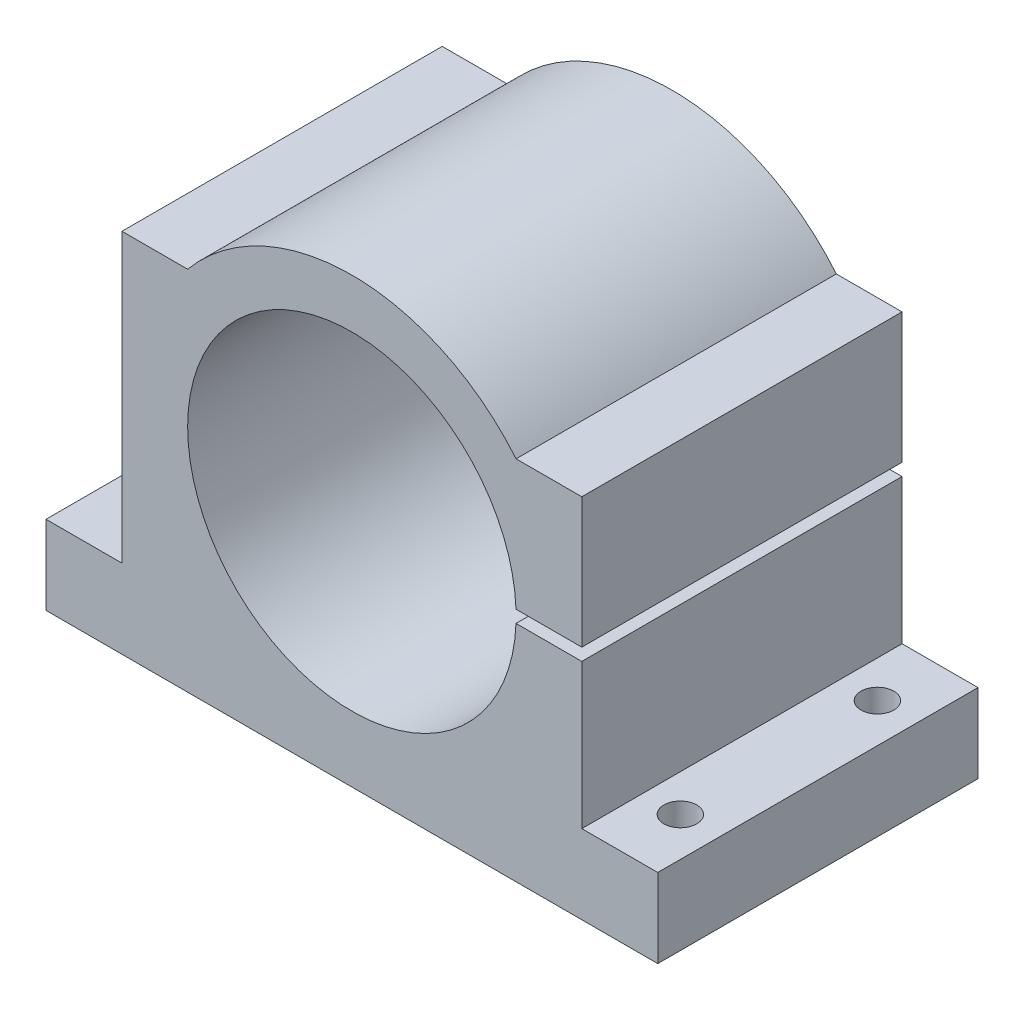
ISO-10303-21;
HEADER;
FILE_DESCRIPTION(('STEP AP214'),'2;1');
FILE_NAME('part.step','',(''),(''),'','','');
FILE_SCHEMA(('AUTOMOTIVE_DESIGN { 1 0 10303 214 1 1 1 1 }'));
ENDSEC;
DATA;
#1=APPLICATION_CONTEXT('core data for automotive mechanical design processes');
#2=APPLICATION_PROTOCOL_DEFINITION('international standard','automotive_design',2000,#1);
#3=PRODUCT_CONTEXT('',#1,'mechanical');
#4=PRODUCT('Part','Part','',(#3));
#5=PRODUCT_RELATED_PRODUCT_CATEGORY('part','',(#4));
#6=PRODUCT_DEFINITION_FORMATION('','',#4);
#7=PRODUCT_DEFINITION_CONTEXT('part definition',#1,'design');
#8=PRODUCT_DEFINITION('design','',#6,#7);
#9=PRODUCT_DEFINITION_SHAPE('','',#8);
#10=(LENGTH_UNIT() NAMED_UNIT(*) SI_UNIT(.MILLI.,.METRE.));
#11=(NAMED_UNIT(*) PLANE_ANGLE_UNIT() SI_UNIT($,.RADIAN.));
#12=(NAMED_UNIT(*) SI_UNIT($,.STERADIAN.) SOLID_ANGLE_UNIT());
#13=UNCERTAINTY_MEASURE_WITH_UNIT(LENGTH_MEASURE(1.E-05),#10,'distance_accuracy_value','');
#14=(GEOMETRIC_REPRESENTATION_CONTEXT(3) GLOBAL_UNCERTAINTY_ASSIGNED_CONTEXT((#13)) GLOBAL_UNIT_ASSIGNED_CONTEXT((#10,
#11,#12)) REPRESENTATION_CONTEXT('',''));
#15=CARTESIAN_POINT('',(0.,0.,0.));
#16=DIRECTION('',(0.,0.,1.));
#17=DIRECTION('',(1.,0.,0.));
#18=AXIS2_PLACEMENT_3D('',#15,#16,#17);
#19=CARTESIAN_POINT('',(0.,0.,78.));
#20=DIRECTION('',(1.,0.,0.));
#21=DIRECTION('',(0.,0.,-1.));
#22=AXIS2_PLACEMENT_3D('',#19,#20,#21);
#23=PLANE('',#22);
#24=DIRECTION('',(0.,-1.,0.));
#25=VECTOR('',#24,1.);
#26=CARTESIAN_POINT('',(0.,0.,0.));
#27=LINE('',#26,#25);
#28=CARTESIAN_POINT('',(0.,19.2264954516723,0.));
#29=VERTEX_POINT('',#28);
#30=CARTESIAN_POINT('',(0.,0.,0.));
#31=VERTEX_POINT('',#30);
#32=EDGE_CURVE('E166',#29,#31,#27,.T.);
#33=ORIENTED_EDGE('',*,*,#32,.T.);
#34=DIRECTION('',(0.,0.,-1.));
#35=VECTOR('',#34,1.);
#36=CARTESIAN_POINT('',(0.,0.,78.));
#37=LINE('',#36,#35);
#38=CARTESIAN_POINT('',(0.,0.,78.));
#39=VERTEX_POINT('',#38);
#40=EDGE_CURVE('E11',#39,#31,#37,.T.);
#41=ORIENTED_EDGE('',*,*,#40,.F.);
#42=DIRECTION('',(0.,-1.,0.));
#43=VECTOR('',#42,1.);
#44=CARTESIAN_POINT('',(0.,0.,78.));
#45=LINE('',#44,#43);
#46=CARTESIAN_POINT('',(0.,19.2264954516723,78.));
#47=VERTEX_POINT('',#46);
#48=EDGE_CURVE('E192',#47,#39,#45,.T.);
#49=ORIENTED_EDGE('',*,*,#48,.F.);
#50=DIRECTION('',(0.,0.,-1.));
#51=VECTOR('',#50,1.);
#52=CARTESIAN_POINT('',(0.,19.2264954516723,78.));
#53=LINE('',#52,#51);
#54=EDGE_CURVE('E162',#47,#29,#53,.T.);
#55=ORIENTED_EDGE('',*,*,#54,.T.);
#56=EDGE_LOOP('',(#33,#41,#49,#55));
#57=FACE_BOUND('',#56,.T.);
#58=ADVANCED_FACE('F32',(#57),#23,.F.);
#59=CARTESIAN_POINT('',(0.,0.,78.));
#60=DIRECTION('',(0.,1.,0.));
#61=DIRECTION('',(-1.,0.,0.));
#62=AXIS2_PLACEMENT_3D('',#59,#60,#61);
#63=PLANE('',#62);
#64=CARTESIAN_POINT('',(139.5,0.,63.));
#65=DIRECTION('',(0.,-1.,0.));
#66=DIRECTION('',(-1.,0.,0.));
#67=AXIS2_PLACEMENT_3D('',#64,#65,#66);
#68=CIRCLE('',#67,4.00000000000002);
#69=CARTESIAN_POINT('',(135.5,0.,63.));
#70=VERTEX_POINT('',#69);
#71=EDGE_CURVE('E371',#70,#70,#68,.T.);
#72=ORIENTED_EDGE('',*,*,#71,.F.);
#73=EDGE_LOOP('',(#72));
#74=FACE_BOUND('',#73,.T.);
#75=CARTESIAN_POINT('',(9.5,0.,15.));
#76=DIRECTION('',(0.,-1.,0.));
#77=DIRECTION('',(1.,0.,0.));
#78=AXIS2_PLACEMENT_3D('',#75,#76,#77);
#79=CIRCLE('',#78,4.);
#80=CARTESIAN_POINT('',(13.5,0.,15.));
#81=VERTEX_POINT('',#80);
#82=EDGE_CURVE('E365',#81,#81,#79,.T.);
#83=ORIENTED_EDGE('',*,*,#82,.F.);
#84=EDGE_LOOP('',(#83));
#85=FACE_BOUND('',#84,.T.);
#86=CARTESIAN_POINT('',(139.5,0.,15.));
#87=DIRECTION('',(0.,-1.,0.));
#88=DIRECTION('',(-1.,0.,0.));
#89=AXIS2_PLACEMENT_3D('',#86,#87,#88);
#90=CIRCLE('',#89,3.99999999999999);
#91=CARTESIAN_POINT('',(135.5,0.,15.));
#92=VERTEX_POINT('',#91);
#93=EDGE_CURVE('E372',#92,#92,#90,.T.);
#94=ORIENTED_EDGE('',*,*,#93,.F.);
#95=EDGE_LOOP('',(#94));
#96=FACE_BOUND('',#95,.T.);
#97=CARTESIAN_POINT('',(9.5,0.,63.));
#98=DIRECTION('',(0.,-1.,0.));
#99=DIRECTION('',(1.,0.,0.));
#100=AXIS2_PLACEMENT_3D('',#97,#98,#99);
#101=CIRCLE('',#100,4.00000000000001);
#102=CARTESIAN_POINT('',(13.5,0.,63.));
#103=VERTEX_POINT('',#102);
#104=EDGE_CURVE('E226',#103,#103,#101,.T.);
#105=ORIENTED_EDGE('',*,*,#104,.F.);
#106=EDGE_LOOP('',(#105));
#107=FACE_BOUND('',#106,.T.);
#108=DIRECTION('',(1.,0.,0.));
#109=VECTOR('',#108,1.);
#110=CARTESIAN_POINT('',(0.,0.,0.));
#111=LINE('',#110,#109);
#112=CARTESIAN_POINT('',(149.,0.,0.));
#113=VERTEX_POINT('',#112);
#114=EDGE_CURVE('E169',#31,#113,#111,.T.);
#115=ORIENTED_EDGE('',*,*,#114,.T.);
#116=DIRECTION('',(0.,0.,-1.));
#117=VECTOR('',#116,1.);
#118=CARTESIAN_POINT('',(149.,0.,78.));
#119=LINE('',#118,#117);
#120=CARTESIAN_POINT('',(149.,0.,78.));
#121=VERTEX_POINT('',#120);
#122=EDGE_CURVE('E41',#121,#113,#119,.T.);
#123=ORIENTED_EDGE('',*,*,#122,.F.);
#124=DIRECTION('',(1.,0.,0.));
#125=VECTOR('',#124,1.);
#126=CARTESIAN_POINT('',(0.,0.,78.));
#127=LINE('',#126,#125);
#128=EDGE_CURVE('E111',#39,#121,#127,.T.);
#129=ORIENTED_EDGE('',*,*,#128,.F.);
#130=ORIENTED_EDGE('',*,*,#40,.T.);
#131=EDGE_LOOP('',(#115,#123,#129,#130));
#132=FACE_BOUND('',#131,.T.);
#133=ADVANCED_FACE('F251',(#74,#85,#96,#107,#132),#63,.F.);
#134=CARTESIAN_POINT('',(149.,0.,78.));
#135=DIRECTION('',(-1.,0.,0.));
#136=DIRECTION('',(0.,0.,1.));
#137=AXIS2_PLACEMENT_3D('',#134,#135,#136);
#138=PLANE('',#137);
#139=DIRECTION('',(0.,1.,0.));
#140=VECTOR('',#139,1.);
#141=CARTESIAN_POINT('',(149.,0.,0.));
#142=LINE('',#141,#140);
#143=CARTESIAN_POINT('',(149.,19.2264954516723,0.));
#144=VERTEX_POINT('',#143);
#145=EDGE_CURVE('E171',#113,#144,#142,.T.);
#146=ORIENTED_EDGE('',*,*,#145,.T.);
#147=DIRECTION('',(0.,0.,-1.));
#148=VECTOR('',#147,1.);
#149=CARTESIAN_POINT('',(149.,19.2264954516723,78.));
#150=LINE('',#149,#148);
#151=CARTESIAN_POINT('',(149.,19.2264954516723,78.));
#152=VERTEX_POINT('',#151);
#153=EDGE_CURVE('E217',#152,#144,#150,.T.);
#154=ORIENTED_EDGE('',*,*,#153,.F.);
#155=DIRECTION('',(0.,1.,0.));
#156=VECTOR('',#155,1.);
#157=CARTESIAN_POINT('',(149.,0.,78.));
#158=LINE('',#157,#156);
#159=EDGE_CURVE('E268',#121,#152,#158,.T.);
#160=ORIENTED_EDGE('',*,*,#159,.F.);
#161=ORIENTED_EDGE('',*,*,#122,.T.);
#162=EDGE_LOOP('',(#146,#154,#160,#161));
#163=FACE_BOUND('',#162,.T.);
#164=ADVANCED_FACE('F256',(#163),#138,.F.);
#165=CARTESIAN_POINT('',(149.,19.2264954516723,78.));
#166=DIRECTION('',(0.,-1.,0.));
#167=DIRECTION('',(1.,0.,0.));
#168=AXIS2_PLACEMENT_3D('',#165,#166,#167);
#169=PLANE('',#168);
#170=CARTESIAN_POINT('',(139.5,19.2264954516723,63.));
#171=DIRECTION('',(0.,-1.,0.));
#172=DIRECTION('',(1.,0.,0.));
#173=AXIS2_PLACEMENT_3D('',#170,#171,#172);
#174=CIRCLE('',#173,4.00000000000002);
#175=CARTESIAN_POINT('',(143.5,19.2264954516723,63.));
#176=VERTEX_POINT('',#175);
#177=EDGE_CURVE('E35',#176,#176,#174,.T.);
#178=ORIENTED_EDGE('',*,*,#177,.T.);
#179=EDGE_LOOP('',(#178));
#180=FACE_BOUND('',#179,.T.);
#181=CARTESIAN_POINT('',(139.5,19.2264954516723,15.));
#182=DIRECTION('',(0.,-1.,0.));
#183=DIRECTION('',(1.,0.,0.));
#184=AXIS2_PLACEMENT_3D('',#181,#182,#183);
#185=CIRCLE('',#184,3.99999999999999);
#186=CARTESIAN_POINT('',(143.5,19.2264954516723,15.));
#187=VERTEX_POINT('',#186);
#188=EDGE_CURVE('E228',#187,#187,#185,.T.);
#189=ORIENTED_EDGE('',*,*,#188,.T.);
#190=EDGE_LOOP('',(#189));
#191=FACE_BOUND('',#190,.T.);
#192=DIRECTION('',(-1.,0.,0.));
#193=VECTOR('',#192,1.);
#194=CARTESIAN_POINT('',(149.,19.2264954516723,0.));
#195=LINE('',#194,#193);
#196=CARTESIAN_POINT('',(130.5,19.2264954516723,0.));
#197=VERTEX_POINT('',#196);
#198=EDGE_CURVE('E173',#144,#197,#195,.T.);
#199=ORIENTED_EDGE('',*,*,#198,.T.);
#200=DIRECTION('',(0.,0.,-1.));
#201=VECTOR('',#200,1.);
#202=CARTESIAN_POINT('',(130.5,19.2264954516723,78.));
#203=LINE('',#202,#201);
#204=CARTESIAN_POINT('',(130.5,19.2264954516723,78.));
#205=VERTEX_POINT('',#204);
#206=EDGE_CURVE('E214',#205,#197,#203,.T.);
#207=ORIENTED_EDGE('',*,*,#206,.F.);
#208=DIRECTION('',(-1.,0.,0.));
#209=VECTOR('',#208,1.);
#210=CARTESIAN_POINT('',(149.,19.2264954516723,78.));
#211=LINE('',#210,#209);
#212=EDGE_CURVE('E270',#152,#205,#211,.T.);
#213=ORIENTED_EDGE('',*,*,#212,.F.);
#214=ORIENTED_EDGE('',*,*,#153,.T.);
#215=EDGE_LOOP('',(#199,#207,#213,#214));
#216=FACE_BOUND('',#215,.T.);
#217=ADVANCED_FACE('F235',(#180,#191,#216),#169,.F.);
#218=CARTESIAN_POINT('',(130.5,19.2264954516723,78.));
#219=DIRECTION('',(-1.,0.,0.));
#220=DIRECTION('',(0.,0.,1.));
#221=AXIS2_PLACEMENT_3D('',#218,#219,#220);
#222=PLANE('',#221);
#223=DIRECTION('',(0.,1.,0.));
#224=VECTOR('',#223,1.);
#225=CARTESIAN_POINT('',(130.5,19.2264954516723,0.));
#226=LINE('',#225,#224);
#227=CARTESIAN_POINT('',(130.5,54.5,0.));
#228=VERTEX_POINT('',#227);
#229=EDGE_CURVE('E175',#197,#228,#226,.T.);
#230=ORIENTED_EDGE('',*,*,#229,.T.);
#231=DIRECTION('',(0.,0.,-1.));
#232=VECTOR('',#231,1.);
#233=CARTESIAN_POINT('',(130.5,54.5,78.));
#234=LINE('',#233,#232);
#235=CARTESIAN_POINT('',(130.5,54.5,78.));
#236=VERTEX_POINT('',#235);
#237=EDGE_CURVE('E211',#236,#228,#234,.T.);
#238=ORIENTED_EDGE('',*,*,#237,.F.);
#239=DIRECTION('',(0.,1.,0.));
#240=VECTOR('',#239,1.);
#241=CARTESIAN_POINT('',(130.5,19.2264954516723,78.));
#242=LINE('',#241,#240);
#243=EDGE_CURVE('E272',#205,#236,#242,.T.);
#244=ORIENTED_EDGE('',*,*,#243,.F.);
#245=ORIENTED_EDGE('',*,*,#206,.T.);
#246=EDGE_LOOP('',(#230,#238,#244,#245));
#247=FACE_BOUND('',#246,.T.);
#248=ADVANCED_FACE('F319',(#247),#222,.F.);
#249=CARTESIAN_POINT('',(130.5,54.5,78.));
#250=DIRECTION('',(0.,-1.,0.));
#251=DIRECTION('',(1.,0.,0.));
#252=AXIS2_PLACEMENT_3D('',#249,#250,#251);
#253=PLANE('',#252);
#254=DIRECTION('',(-1.,0.,0.));
#255=VECTOR('',#254,1.);
#256=CARTESIAN_POINT('',(130.5,54.5,0.));
#257=LINE('',#256,#255);
#258=CARTESIAN_POINT('',(114.471865105346,54.5,0.));
#259=VERTEX_POINT('',#258);
#260=EDGE_CURVE('E177',#228,#259,#257,.T.);
#261=ORIENTED_EDGE('',*,*,#260,.T.);
#262=DIRECTION('',(0.,0.,-1.));
#263=VECTOR('',#262,1.);
#264=CARTESIAN_POINT('',(114.471865105346,54.5,78.));
#265=LINE('',#264,#263);
#266=CARTESIAN_POINT('',(114.471865105346,54.5,78.));
#267=VERTEX_POINT('',#266);
#268=EDGE_CURVE('E208',#267,#259,#265,.T.);
#269=ORIENTED_EDGE('',*,*,#268,.F.);
#270=DIRECTION('',(-1.,0.,0.));
#271=VECTOR('',#270,1.);
#272=CARTESIAN_POINT('',(130.5,54.5,78.));
#273=LINE('',#272,#271);
#274=EDGE_CURVE('E278',#236,#267,#273,.T.);
#275=ORIENTED_EDGE('',*,*,#274,.F.);
#276=ORIENTED_EDGE('',*,*,#237,.T.);
#277=EDGE_LOOP('',(#261,#269,#275,#276));
#278=FACE_BOUND('',#277,.T.);
#279=ADVANCED_FACE('F314',(#278),#253,.F.);
#280=CARTESIAN_POINT('',(74.5,56.,78.));
#281=DIRECTION('',(0.,0.,-1.));
#282=DIRECTION('',(-1.,0.,0.));
#283=AXIS2_PLACEMENT_3D('',#280,#281,#282);
#284=CYLINDRICAL_SURFACE('',#283,40.);
#285=CARTESIAN_POINT('',(74.5,56.,0.));
#286=DIRECTION('',(0.,0.,-1.));
#287=DIRECTION('',(1.,0.,0.));
#288=AXIS2_PLACEMENT_3D('',#285,#286,#287);
#289=CIRCLE('',#288,40.);
#290=CARTESIAN_POINT('',(114.471865105346,57.5,0.));
#291=VERTEX_POINT('',#290);
#292=EDGE_CURVE('E179',#259,#291,#289,.T.);
#293=ORIENTED_EDGE('',*,*,#292,.T.);
#294=DIRECTION('',(0.,0.,-1.));
#295=VECTOR('',#294,1.);
#296=CARTESIAN_POINT('',(114.471865105346,57.5,78.));
#297=LINE('',#296,#295);
#298=CARTESIAN_POINT('',(114.471865105346,57.5,78.));
#299=VERTEX_POINT('',#298);
#300=EDGE_CURVE('E205',#299,#291,#297,.T.);
#301=ORIENTED_EDGE('',*,*,#300,.F.);
#302=CARTESIAN_POINT('',(74.5,56.,78.));
#303=DIRECTION('',(0.,0.,-1.));
#304=DIRECTION('',(1.,0.,0.));
#305=AXIS2_PLACEMENT_3D('',#302,#303,#304);
#306=CIRCLE('',#305,40.);
#307=EDGE_CURVE('E280',#267,#299,#306,.T.);
#308=ORIENTED_EDGE('',*,*,#307,.F.);
#309=ORIENTED_EDGE('',*,*,#268,.T.);
#310=EDGE_LOOP('',(#293,#301,#308,#309));
#311=FACE_BOUND('',#310,.T.);
#312=ADVANCED_FACE('F309',(#311),#284,.F.);
#313=CARTESIAN_POINT('',(130.5,57.5,78.));
#314=DIRECTION('',(0.,1.,0.));
#315=DIRECTION('',(-1.,0.,0.));
#316=AXIS2_PLACEMENT_3D('',#313,#314,#315);
#317=PLANE('',#316);
#318=DIRECTION('',(1.,0.,0.));
#319=VECTOR('',#318,1.);
#320=CARTESIAN_POINT('',(130.5,57.5,0.));
#321=LINE('',#320,#319);
#322=CARTESIAN_POINT('',(130.5,57.5,0.));
#323=VERTEX_POINT('',#322);
#324=EDGE_CURVE('E181',#291,#323,#321,.T.);
#325=ORIENTED_EDGE('',*,*,#324,.T.);
#326=DIRECTION('',(0.,0.,-1.));
#327=VECTOR('',#326,1.);
#328=CARTESIAN_POINT('',(130.5,57.5,78.));
#329=LINE('',#328,#327);
#330=CARTESIAN_POINT('',(130.5,57.5,78.));
#331=VERTEX_POINT('',#330);
#332=EDGE_CURVE('E202',#331,#323,#329,.T.);
#333=ORIENTED_EDGE('',*,*,#332,.F.);
#334=DIRECTION('',(1.,0.,0.));
#335=VECTOR('',#334,1.);
#336=CARTESIAN_POINT('',(130.5,57.5,78.));
#337=LINE('',#336,#335);
#338=EDGE_CURVE('E282',#299,#331,#337,.T.);
#339=ORIENTED_EDGE('',*,*,#338,.F.);
#340=ORIENTED_EDGE('',*,*,#300,.T.);
#341=EDGE_LOOP('',(#325,#333,#339,#340));
#342=FACE_BOUND('',#341,.T.);
#343=ADVANCED_FACE('F305',(#342),#317,.F.);
#344=CARTESIAN_POINT('',(130.5,57.5,78.));
#345=DIRECTION('',(-1.,0.,0.));
#346=DIRECTION('',(0.,-1.,0.));
#347=AXIS2_PLACEMENT_3D('',#344,#345,#346);
#348=PLANE('',#347);
#349=DIRECTION('',(0.,1.,0.));
#350=VECTOR('',#349,1.);
#351=CARTESIAN_POINT('',(130.5,57.5,0.));
#352=LINE('',#351,#350);
#353=CARTESIAN_POINT('',(130.5,89.2264954516723,0.));
#354=VERTEX_POINT('',#353);
#355=EDGE_CURVE('E183',#323,#354,#352,.T.);
#356=ORIENTED_EDGE('',*,*,#355,.T.);
#357=DIRECTION('',(0.,0.,-1.));
#358=VECTOR('',#357,1.);
#359=CARTESIAN_POINT('',(130.5,89.2264954516723,78.));
#360=LINE('',#359,#358);
#361=CARTESIAN_POINT('',(130.5,89.2264954516723,78.));
#362=VERTEX_POINT('',#361);
#363=EDGE_CURVE('E199',#362,#354,#360,.T.);
#364=ORIENTED_EDGE('',*,*,#363,.F.);
#365=DIRECTION('',(0.,1.,0.));
#366=VECTOR('',#365,1.);
#367=CARTESIAN_POINT('',(130.5,57.5,78.));
#368=LINE('',#367,#366);
#369=EDGE_CURVE('E284',#331,#362,#368,.T.);
#370=ORIENTED_EDGE('',*,*,#369,.F.);
#371=ORIENTED_EDGE('',*,*,#332,.T.);
#372=EDGE_LOOP('',(#356,#364,#370,#371));
#373=FACE_BOUND('',#372,.T.);
#374=ADVANCED_FACE('F301',(#373),#348,.F.);
#375=CARTESIAN_POINT('',(130.5,89.2264954516723,78.));
#376=DIRECTION('',(0.,-1.,0.));
#377=DIRECTION('',(1.,0.,0.));
#378=AXIS2_PLACEMENT_3D('',#375,#376,#377);
#379=PLANE('',#378);
#380=DIRECTION('',(-1.,0.,0.));
#381=VECTOR('',#380,1.);
#382=CARTESIAN_POINT('',(130.5,89.2264954516723,0.));
#383=LINE('',#382,#381);
#384=CARTESIAN_POINT('',(114.5,89.2264954516723,0.));
#385=VERTEX_POINT('',#384);
#386=EDGE_CURVE('E185',#354,#385,#383,.T.);
#387=ORIENTED_EDGE('',*,*,#386,.T.);
#388=DIRECTION('',(0.,0.,-1.));
#389=VECTOR('',#388,1.);
#390=CARTESIAN_POINT('',(114.5,89.2264954516723,78.));
#391=LINE('',#390,#389);
#392=CARTESIAN_POINT('',(114.5,89.2264954516723,78.));
#393=VERTEX_POINT('',#392);
#394=EDGE_CURVE('E196',#393,#385,#391,.T.);
#395=ORIENTED_EDGE('',*,*,#394,.F.);
#396=DIRECTION('',(-1.,0.,0.));
#397=VECTOR('',#396,1.);
#398=CARTESIAN_POINT('',(130.5,89.2264954516723,78.));
#399=LINE('',#398,#397);
#400=EDGE_CURVE('E286',#362,#393,#399,.T.);
#401=ORIENTED_EDGE('',*,*,#400,.F.);
#402=ORIENTED_EDGE('',*,*,#363,.T.);
#403=EDGE_LOOP('',(#387,#395,#401,#402));
#404=FACE_BOUND('',#403,.T.);
#405=ADVANCED_FACE('F292',(#404),#379,.F.);
#406=CARTESIAN_POINT('',(74.5,56.,78.));
#407=DIRECTION('',(0.,0.,-1.));
#408=DIRECTION('',(-1.,0.,0.));
#409=AXIS2_PLACEMENT_3D('',#406,#407,#408);
#410=CYLINDRICAL_SURFACE('',#409,52.);
#411=CARTESIAN_POINT('',(74.5,56.,0.));
#412=DIRECTION('',(0.,0.,1.));
#413=DIRECTION('',(-1.,0.,0.));
#414=AXIS2_PLACEMENT_3D('',#411,#412,#413);
#415=CIRCLE('',#414,52.);
#416=CARTESIAN_POINT('',(34.5,89.2264954516723,0.));
#417=VERTEX_POINT('',#416);
#418=EDGE_CURVE('E187',#385,#417,#415,.T.);
#419=ORIENTED_EDGE('',*,*,#418,.T.);
#420=DIRECTION('',(0.,0.,-1.));
#421=VECTOR('',#420,1.);
#422=CARTESIAN_POINT('',(34.5,89.2264954516723,78.));
#423=LINE('',#422,#421);
#424=CARTESIAN_POINT('',(34.5,89.2264954516723,78.));
#425=VERTEX_POINT('',#424);
#426=EDGE_CURVE('E157',#425,#417,#423,.T.);
#427=ORIENTED_EDGE('',*,*,#426,.F.);
#428=CARTESIAN_POINT('',(74.5,56.,78.));
#429=DIRECTION('',(0.,0.,1.));
#430=DIRECTION('',(-1.,0.,0.));
#431=AXIS2_PLACEMENT_3D('',#428,#429,#430);
#432=CIRCLE('',#431,52.);
#433=EDGE_CURVE('E148',#393,#425,#432,.T.);
#434=ORIENTED_EDGE('',*,*,#433,.F.);
#435=ORIENTED_EDGE('',*,*,#394,.T.);
#436=EDGE_LOOP('',(#419,#427,#434,#435));
#437=FACE_BOUND('',#436,.T.);
#438=ADVANCED_FACE('F296',(#437),#410,.T.);
#439=CARTESIAN_POINT('',(18.5,89.2264954516723,78.));
#440=DIRECTION('',(0.,-1.,0.));
#441=DIRECTION('',(0.,0.,-1.));
#442=AXIS2_PLACEMENT_3D('',#439,#440,#441);
#443=PLANE('',#442);
#444=DIRECTION('',(-1.,0.,0.));
#445=VECTOR('',#444,1.);
#446=CARTESIAN_POINT('',(18.5,89.2264954516723,0.));
#447=LINE('',#446,#445);
#448=CARTESIAN_POINT('',(18.5,89.2264954516723,0.));
#449=VERTEX_POINT('',#448);
#450=EDGE_CURVE('E156',#417,#449,#447,.T.);
#451=ORIENTED_EDGE('',*,*,#450,.T.);
#452=DIRECTION('',(0.,0.,-1.));
#453=VECTOR('',#452,1.);
#454=CARTESIAN_POINT('',(18.5,89.2264954516723,78.));
#455=LINE('',#454,#453);
#456=CARTESIAN_POINT('',(18.5,89.2264954516723,78.));
#457=VERTEX_POINT('',#456);
#458=EDGE_CURVE('E153',#457,#449,#455,.T.);
#459=ORIENTED_EDGE('',*,*,#458,.F.);
#460=DIRECTION('',(-1.,0.,0.));
#461=VECTOR('',#460,1.);
#462=CARTESIAN_POINT('',(18.5,89.2264954516723,78.));
#463=LINE('',#462,#461);
#464=EDGE_CURVE('E142',#425,#457,#463,.T.);
#465=ORIENTED_EDGE('',*,*,#464,.F.);
#466=ORIENTED_EDGE('',*,*,#426,.T.);
#467=EDGE_LOOP('',(#451,#459,#465,#466));
#468=FACE_BOUND('',#467,.T.);
#469=ADVANCED_FACE('F154',(#468),#443,.F.);
#470=CARTESIAN_POINT('',(18.5,19.2264954516723,78.));
#471=DIRECTION('',(1.,0.,0.));
#472=DIRECTION('',(0.,1.,0.));
#473=AXIS2_PLACEMENT_3D('',#470,#471,#472);
#474=PLANE('',#473);
#475=DIRECTION('',(0.,-1.,0.));
#476=VECTOR('',#475,1.);
#477=CARTESIAN_POINT('',(18.5,19.2264954516723,0.));
#478=LINE('',#477,#476);
#479=CARTESIAN_POINT('',(18.5,19.2264954516723,0.));
#480=VERTEX_POINT('',#479);
#481=EDGE_CURVE('E97',#449,#480,#478,.T.);
#482=ORIENTED_EDGE('',*,*,#481,.T.);
#483=DIRECTION('',(0.,0.,-1.));
#484=VECTOR('',#483,1.);
#485=CARTESIAN_POINT('',(18.5,19.2264954516723,78.));
#486=LINE('',#485,#484);
#487=CARTESIAN_POINT('',(18.5,19.2264954516723,78.));
#488=VERTEX_POINT('',#487);
#489=EDGE_CURVE('E158',#488,#480,#486,.T.);
#490=ORIENTED_EDGE('',*,*,#489,.F.);
#491=DIRECTION('',(0.,-1.,0.));
#492=VECTOR('',#491,1.);
#493=CARTESIAN_POINT('',(18.5,19.2264954516723,78.));
#494=LINE('',#493,#492);
#495=EDGE_CURVE('E146',#457,#488,#494,.T.);
#496=ORIENTED_EDGE('',*,*,#495,.F.);
#497=ORIENTED_EDGE('',*,*,#458,.T.);
#498=EDGE_LOOP('',(#482,#490,#496,#497));
#499=FACE_BOUND('',#498,.T.);
#500=ADVANCED_FACE('F160',(#499),#474,.F.);
#501=CARTESIAN_POINT('',(0.,19.2264954516723,78.));
#502=DIRECTION('',(0.,-1.,0.));
#503=DIRECTION('',(0.,0.,-1.));
#504=AXIS2_PLACEMENT_3D('',#501,#502,#503);
#505=PLANE('',#504);
#506=CARTESIAN_POINT('',(9.49999999999999,19.2264954516723,15.));
#507=DIRECTION('',(0.,-1.,0.));
#508=DIRECTION('',(0.,0.,-1.));
#509=AXIS2_PLACEMENT_3D('',#506,#507,#508);
#510=CIRCLE('',#509,4.);
#511=CARTESIAN_POINT('',(9.49999999999999,19.2264954516723,11.));
#512=VERTEX_POINT('',#511);
#513=EDGE_CURVE('E225',#512,#512,#510,.T.);
#514=ORIENTED_EDGE('',*,*,#513,.T.);
#515=EDGE_LOOP('',(#514));
#516=FACE_BOUND('',#515,.T.);
#517=CARTESIAN_POINT('',(9.49999999999999,19.2264954516723,63.));
#518=DIRECTION('',(0.,-1.,0.));
#519=DIRECTION('',(0.,0.,-1.));
#520=AXIS2_PLACEMENT_3D('',#517,#518,#519);
#521=CIRCLE('',#520,4.00000000000001);
#522=CARTESIAN_POINT('',(9.49999999999999,19.2264954516723,59.));
#523=VERTEX_POINT('',#522);
#524=EDGE_CURVE('E222',#523,#523,#521,.T.);
#525=ORIENTED_EDGE('',*,*,#524,.T.);
#526=EDGE_LOOP('',(#525));
#527=FACE_BOUND('',#526,.T.);
#528=DIRECTION('',(-1.,0.,0.));
#529=VECTOR('',#528,1.);
#530=CARTESIAN_POINT('',(0.,19.2264954516723,0.));
#531=LINE('',#530,#529);
#532=EDGE_CURVE('E103',#480,#29,#531,.T.);
#533=ORIENTED_EDGE('',*,*,#532,.T.);
#534=ORIENTED_EDGE('',*,*,#54,.F.);
#535=DIRECTION('',(-1.,0.,0.));
#536=VECTOR('',#535,1.);
#537=CARTESIAN_POINT('',(0.,19.2264954516723,78.));
#538=LINE('',#537,#536);
#539=EDGE_CURVE('E50',#488,#47,#538,.T.);
#540=ORIENTED_EDGE('',*,*,#539,.F.);
#541=ORIENTED_EDGE('',*,*,#489,.T.);
#542=EDGE_LOOP('',(#533,#534,#540,#541));
#543=FACE_BOUND('',#542,.T.);
#544=ADVANCED_FACE('F347',(#516,#527,#543),#505,.F.);
#545=CARTESIAN_POINT('',(74.5,56.,78.));
#546=DIRECTION('',(0.,0.,-1.));
#547=DIRECTION('',(-1.,0.,0.));
#548=AXIS2_PLACEMENT_3D('',#545,#546,#547);
#549=PLANE('',#548);
#550=ORIENTED_EDGE('',*,*,#48,.T.);
#551=ORIENTED_EDGE('',*,*,#128,.T.);
#552=ORIENTED_EDGE('',*,*,#159,.T.);
#553=ORIENTED_EDGE('',*,*,#212,.T.);
#554=ORIENTED_EDGE('',*,*,#243,.T.);
#555=ORIENTED_EDGE('',*,*,#274,.T.);
#556=ORIENTED_EDGE('',*,*,#307,.T.);
#557=ORIENTED_EDGE('',*,*,#338,.T.);
#558=ORIENTED_EDGE('',*,*,#369,.T.);
#559=ORIENTED_EDGE('',*,*,#400,.T.);
#560=ORIENTED_EDGE('',*,*,#433,.T.);
#561=ORIENTED_EDGE('',*,*,#464,.T.);
#562=ORIENTED_EDGE('',*,*,#495,.T.);
#563=ORIENTED_EDGE('',*,*,#539,.T.);
#564=EDGE_LOOP('',(#550,#551,#552,#553,#554,#555,#556,#557,#558,#559,#560,#561,#562,#563));
#565=FACE_BOUND('',#564,.T.);
#566=ADVANCED_FACE('F144',(#565),#549,.F.);
#567=CARTESIAN_POINT('',(74.5,56.,0.));
#568=DIRECTION('',(0.,0.,-1.));
#569=DIRECTION('',(-1.,0.,0.));
#570=AXIS2_PLACEMENT_3D('',#567,#568,#569);
#571=PLANE('',#570);
#572=ORIENTED_EDGE('',*,*,#32,.F.);
#573=ORIENTED_EDGE('',*,*,#532,.F.);
#574=ORIENTED_EDGE('',*,*,#481,.F.);
#575=ORIENTED_EDGE('',*,*,#450,.F.);
#576=ORIENTED_EDGE('',*,*,#418,.F.);
#577=ORIENTED_EDGE('',*,*,#386,.F.);
#578=ORIENTED_EDGE('',*,*,#355,.F.);
#579=ORIENTED_EDGE('',*,*,#324,.F.);
#580=ORIENTED_EDGE('',*,*,#292,.F.);
#581=ORIENTED_EDGE('',*,*,#260,.F.);
#582=ORIENTED_EDGE('',*,*,#229,.F.);
#583=ORIENTED_EDGE('',*,*,#198,.F.);
#584=ORIENTED_EDGE('',*,*,#145,.F.);
#585=ORIENTED_EDGE('',*,*,#114,.F.);
#586=EDGE_LOOP('',(#572,#573,#574,#575,#576,#577,#578,#579,#580,#581,#582,#583,#584,#585));
#587=FACE_BOUND('',#586,.T.);
#588=ADVANCED_FACE('F262',(#587),#571,.T.);
#589=CARTESIAN_POINT('',(9.49999999999998,108.,63.));
#590=DIRECTION('',(0.,-1.,0.));
#591=DIRECTION('',(1.,0.,0.));
#592=AXIS2_PLACEMENT_3D('',#589,#590,#591);
#593=CYLINDRICAL_SURFACE('',#592,4.00000000000001);
#594=ORIENTED_EDGE('',*,*,#104,.T.);
#595=EDGE_LOOP('',(#594));
#596=FACE_BOUND('',#595,.T.);
#597=ORIENTED_EDGE('',*,*,#524,.F.);
#598=EDGE_LOOP('',(#597));
#599=FACE_BOUND('',#598,.T.);
#600=ADVANCED_FACE('F353',(#596,#599),#593,.F.);
#601=CARTESIAN_POINT('',(9.49999999999998,108.,15.));
#602=DIRECTION('',(0.,-1.,0.));
#603=DIRECTION('',(1.,0.,0.));
#604=AXIS2_PLACEMENT_3D('',#601,#602,#603);
#605=CYLINDRICAL_SURFACE('',#604,4.);
#606=ORIENTED_EDGE('',*,*,#82,.T.);
#607=EDGE_LOOP('',(#606));
#608=FACE_BOUND('',#607,.T.);
#609=ORIENTED_EDGE('',*,*,#513,.F.);
#610=EDGE_LOOP('',(#609));
#611=FACE_BOUND('',#610,.T.);
#612=ADVANCED_FACE('F245',(#608,#611),#605,.F.);
#613=CARTESIAN_POINT('',(139.5,108.,15.));
#614=DIRECTION('',(0.,-1.,0.));
#615=DIRECTION('',(1.,0.,0.));
#616=AXIS2_PLACEMENT_3D('',#613,#614,#615);
#617=CYLINDRICAL_SURFACE('',#616,3.99999999999999);
#618=ORIENTED_EDGE('',*,*,#93,.T.);
#619=EDGE_LOOP('',(#618));
#620=FACE_BOUND('',#619,.T.);
#621=ORIENTED_EDGE('',*,*,#188,.F.);
#622=EDGE_LOOP('',(#621));
#623=FACE_BOUND('',#622,.T.);
#624=ADVANCED_FACE('F239',(#620,#623),#617,.F.);
#625=CARTESIAN_POINT('',(139.5,108.,63.));
#626=DIRECTION('',(0.,-1.,0.));
#627=DIRECTION('',(1.,0.,0.));
#628=AXIS2_PLACEMENT_3D('',#625,#626,#627);
#629=CYLINDRICAL_SURFACE('',#628,4.00000000000002);
#630=ORIENTED_EDGE('',*,*,#71,.T.);
#631=EDGE_LOOP('',(#630));
#632=FACE_BOUND('',#631,.T.);
#633=ORIENTED_EDGE('',*,*,#177,.F.);
#634=EDGE_LOOP('',(#633));
#635=FACE_BOUND('',#634,.T.);
#636=ADVANCED_FACE('F237',(#632,#635),#629,.F.);
#637=CLOSED_SHELL('',(#58,#133,#164,#217,#248,#279,#312,#343,#374,#405,#438,#469,#500,#544,#566,
#588,#600,#612,#624,#636));
#638=MANIFOLD_SOLID_BREP('B2',#637);
#639=ADVANCED_BREP_SHAPE_REPRESENTATION('',(#18,#638),#14);
#640=SHAPE_DEFINITION_REPRESENTATION(#9,#639);
ENDSEC;
END-ISO-10303-21;
